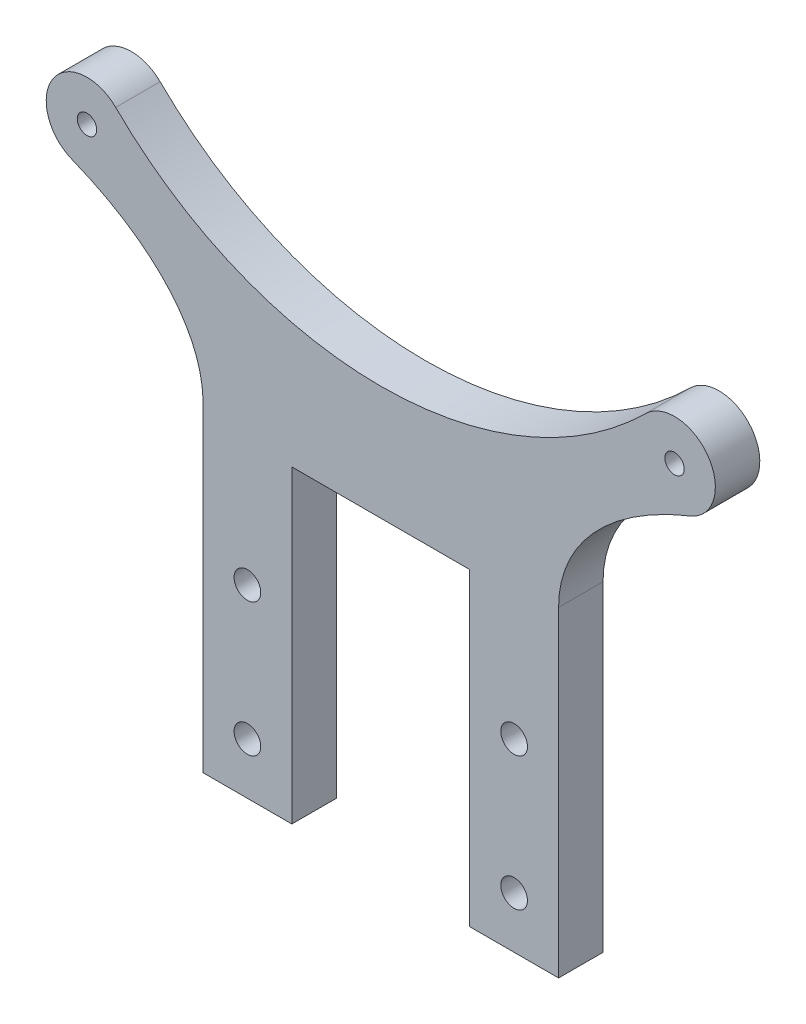
ISO-10303-21;
HEADER;
FILE_DESCRIPTION(('STEP AP214'),'2;1');
FILE_NAME('part.step','',(''),(''),'','','');
FILE_SCHEMA(('AUTOMOTIVE_DESIGN { 1 0 10303 214 1 1 1 1 }'));
ENDSEC;
DATA;
#1=APPLICATION_CONTEXT('core data for automotive mechanical design processes');
#2=APPLICATION_PROTOCOL_DEFINITION('international standard','automotive_design',2000,#1);
#3=PRODUCT_CONTEXT('',#1,'mechanical');
#4=PRODUCT('Part','Part','',(#3));
#5=PRODUCT_RELATED_PRODUCT_CATEGORY('part','',(#4));
#6=PRODUCT_DEFINITION_FORMATION('','',#4);
#7=PRODUCT_DEFINITION_CONTEXT('part definition',#1,'design');
#8=PRODUCT_DEFINITION('design','',#6,#7);
#9=PRODUCT_DEFINITION_SHAPE('','',#8);
#10=(LENGTH_UNIT() NAMED_UNIT(*) SI_UNIT(.MILLI.,.METRE.));
#11=(NAMED_UNIT(*) PLANE_ANGLE_UNIT() SI_UNIT($,.RADIAN.));
#12=(NAMED_UNIT(*) SI_UNIT($,.STERADIAN.) SOLID_ANGLE_UNIT());
#13=UNCERTAINTY_MEASURE_WITH_UNIT(LENGTH_MEASURE(1.E-05),#10,'distance_accuracy_value','');
#14=(GEOMETRIC_REPRESENTATION_CONTEXT(3) GLOBAL_UNCERTAINTY_ASSIGNED_CONTEXT((#13)) GLOBAL_UNIT_ASSIGNED_CONTEXT((#10,
#11,#12)) REPRESENTATION_CONTEXT('',''));
#15=CARTESIAN_POINT('',(0.,0.,0.));
#16=DIRECTION('',(0.,0.,1.));
#17=DIRECTION('',(1.,0.,0.));
#18=AXIS2_PLACEMENT_3D('',#15,#16,#17);
#19=CARTESIAN_POINT('',(-68.6622200178345,1.67032816320576,6.35));
#20=DIRECTION('',(0.,0.,-1.));
#21=DIRECTION('',(-1.,0.,0.));
#22=AXIS2_PLACEMENT_3D('',#19,#20,#21);
#23=PLANE('',#22);
#24=CARTESIAN_POINT('',(19.05,-36.83,6.35));
#25=DIRECTION('',(0.,0.,1.));
#26=DIRECTION('',(-1.,0.,0.));
#27=AXIS2_PLACEMENT_3D('',#24,#25,#26);
#28=CIRCLE('',#27,1.905);
#29=CARTESIAN_POINT('',(17.145,-36.83,6.35));
#30=VERTEX_POINT('',#29);
#31=EDGE_CURVE('E315',#30,#30,#28,.T.);
#32=ORIENTED_EDGE('',*,*,#31,.F.);
#33=EDGE_LOOP('',(#32));
#34=FACE_BOUND('',#33,.T.);
#35=CARTESIAN_POINT('',(-19.05,-17.78,6.35));
#36=DIRECTION('',(0.,0.,1.));
#37=DIRECTION('',(1.,0.,0.));
#38=AXIS2_PLACEMENT_3D('',#35,#36,#37);
#39=CIRCLE('',#38,1.905);
#40=CARTESIAN_POINT('',(-17.145,-17.78,6.35));
#41=VERTEX_POINT('',#40);
#42=EDGE_CURVE('E303',#41,#41,#39,.T.);
#43=ORIENTED_EDGE('',*,*,#42,.F.);
#44=EDGE_LOOP('',(#43));
#45=FACE_BOUND('',#44,.T.);
#46=CARTESIAN_POINT('',(-41.964300524372,27.7449038124335,6.35));
#47=DIRECTION('',(0.,0.,1.));
#48=DIRECTION('',(1.,0.,0.));
#49=AXIS2_PLACEMENT_3D('',#46,#47,#48);
#50=CIRCLE('',#49,1.3890625);
#51=CARTESIAN_POINT('',(-40.575238024372,27.7449038124335,6.35));
#52=VERTEX_POINT('',#51);
#53=EDGE_CURVE('E159',#52,#52,#50,.T.);
#54=ORIENTED_EDGE('',*,*,#53,.F.);
#55=EDGE_LOOP('',(#54));
#56=FACE_BOUND('',#55,.T.);
#57=DIRECTION('',(0.,1.,0.));
#58=VECTOR('',#57,1.);
#59=CARTESIAN_POINT('',(-12.7,0.,6.35));
#60=LINE('',#59,#58);
#61=CARTESIAN_POINT('',(-12.7,-44.1799362896269,6.35));
#62=VERTEX_POINT('',#61);
#63=CARTESIAN_POINT('',(-12.7,0.,6.35));
#64=VERTEX_POINT('',#63);
#65=EDGE_CURVE('E178',#62,#64,#60,.T.);
#66=ORIENTED_EDGE('',*,*,#65,.T.);
#67=DIRECTION('',(1.,0.,0.));
#68=VECTOR('',#67,1.);
#69=CARTESIAN_POINT('',(-12.7,0.,6.35));
#70=LINE('',#69,#68);
#71=CARTESIAN_POINT('',(12.7,0.,6.35));
#72=VERTEX_POINT('',#71);
#73=EDGE_CURVE('E105',#64,#72,#70,.T.);
#74=ORIENTED_EDGE('',*,*,#73,.T.);
#75=DIRECTION('',(0.,-1.,0.));
#76=VECTOR('',#75,1.);
#77=CARTESIAN_POINT('',(12.7,0.,6.35));
#78=LINE('',#77,#76);
#79=CARTESIAN_POINT('',(12.7,-44.1799362896269,6.35));
#80=VERTEX_POINT('',#79);
#81=EDGE_CURVE('E205',#72,#80,#78,.T.);
#82=ORIENTED_EDGE('',*,*,#81,.T.);
#83=DIRECTION('',(1.,0.,0.));
#84=VECTOR('',#83,1.);
#85=CARTESIAN_POINT('',(25.4,-44.1799362896269,6.35));
#86=LINE('',#85,#84);
#87=CARTESIAN_POINT('',(25.4,-44.1799362896269,6.35));
#88=VERTEX_POINT('',#87);
#89=EDGE_CURVE('E224',#80,#88,#86,.T.);
#90=ORIENTED_EDGE('',*,*,#89,.T.);
#91=DIRECTION('',(0.,1.,0.));
#92=VECTOR('',#91,1.);
#93=CARTESIAN_POINT('',(25.4,1.6703281632059,6.35));
#94=LINE('',#93,#92);
#95=CARTESIAN_POINT('',(25.4,1.6703281632059,6.35));
#96=VERTEX_POINT('',#95);
#97=EDGE_CURVE('E221',#88,#96,#94,.T.);
#98=ORIENTED_EDGE('',*,*,#97,.T.);
#99=CARTESIAN_POINT('',(68.6622200178345,1.67032816320576,6.35));
#100=DIRECTION('',(0.,0.,-1.));
#101=DIRECTION('',(-1.,0.,0.));
#102=AXIS2_PLACEMENT_3D('',#99,#100,#101);
#103=ELLIPSE('',#102,43.2622200178345,25.0857126340961);
#104=CARTESIAN_POINT('',(44.1259495460451,22.3312444491636,6.35));
#105=VERTEX_POINT('',#104);
#106=EDGE_CURVE('E223',#96,#105,#103,.T.);
#107=ORIENTED_EDGE('',*,*,#106,.T.);
#108=CARTESIAN_POINT('',(41.964300524372,27.7449038124335,6.35));
#109=DIRECTION('',(0.,0.,1.));
#110=DIRECTION('',(-1.,0.,0.));
#111=AXIS2_PLACEMENT_3D('',#108,#109,#110);
#112=CIRCLE('',#111,5.82927389941654);
#113=CARTESIAN_POINT('',(37.865222263156,31.8895378858885,6.35));
#114=VERTEX_POINT('',#113);
#115=EDGE_CURVE('E226',#105,#114,#112,.T.);
#116=ORIENTED_EDGE('',*,*,#115,.T.);
#117=CARTESIAN_POINT('',(0.,70.1755818181818,6.35));
#118=DIRECTION('',(0.,0.,-1.));
#119=DIRECTION('',(-1.,0.,0.));
#120=AXIS2_PLACEMENT_3D('',#117,#118,#119);
#121=CIRCLE('',#120,53.8478989100196);
#122=CARTESIAN_POINT('',(-37.865222263156,31.8895378858885,6.35));
#123=VERTEX_POINT('',#122);
#124=EDGE_CURVE('E487',#114,#123,#121,.T.);
#125=ORIENTED_EDGE('',*,*,#124,.T.);
#126=CARTESIAN_POINT('',(-41.964300524372,27.7449038124335,6.35));
#127=DIRECTION('',(0.,0.,1.));
#128=DIRECTION('',(1.,0.,0.));
#129=AXIS2_PLACEMENT_3D('',#126,#127,#128);
#130=CIRCLE('',#129,5.82927389941654);
#131=CARTESIAN_POINT('',(-44.1259495460451,22.3312444491636,6.35));
#132=VERTEX_POINT('',#131);
#133=EDGE_CURVE('E136',#123,#132,#130,.T.);
#134=ORIENTED_EDGE('',*,*,#133,.T.);
#135=CARTESIAN_POINT('',(-68.6622200178345,1.67032816320576,6.35));
#136=DIRECTION('',(0.,0.,-1.));
#137=DIRECTION('',(1.,0.,0.));
#138=AXIS2_PLACEMENT_3D('',#135,#136,#137);
#139=ELLIPSE('',#138,43.2622200178345,25.0857126340961);
#140=CARTESIAN_POINT('',(-25.4,1.67032816320593,6.35));
#141=VERTEX_POINT('',#140);
#142=EDGE_CURVE('E130',#132,#141,#139,.T.);
#143=ORIENTED_EDGE('',*,*,#142,.T.);
#144=DIRECTION('',(0.,-1.,0.));
#145=VECTOR('',#144,1.);
#146=CARTESIAN_POINT('',(-25.4,1.67032816320592,6.35));
#147=LINE('',#146,#145);
#148=CARTESIAN_POINT('',(-25.4,-44.1799362896269,6.35));
#149=VERTEX_POINT('',#148);
#150=EDGE_CURVE('E134',#141,#149,#147,.T.);
#151=ORIENTED_EDGE('',*,*,#150,.T.);
#152=DIRECTION('',(1.,0.,0.));
#153=VECTOR('',#152,1.);
#154=CARTESIAN_POINT('',(-25.4,-44.1799362896269,6.35));
#155=LINE('',#154,#153);
#156=EDGE_CURVE('E50',#149,#62,#155,.T.);
#157=ORIENTED_EDGE('',*,*,#156,.T.);
#158=EDGE_LOOP('',(#66,#74,#82,#90,#98,#107,#116,#125,#134,#143,#151,#157));
#159=FACE_BOUND('',#158,.T.);
#160=CARTESIAN_POINT('',(41.964300524372,27.7449038124335,6.35));
#161=DIRECTION('',(0.,0.,1.));
#162=DIRECTION('',(-1.,0.,0.));
#163=AXIS2_PLACEMENT_3D('',#160,#161,#162);
#164=CIRCLE('',#163,1.3890625);
#165=CARTESIAN_POINT('',(40.575238024372,27.7449038124335,6.35));
#166=VERTEX_POINT('',#165);
#167=EDGE_CURVE('E297',#166,#166,#164,.T.);
#168=ORIENTED_EDGE('',*,*,#167,.F.);
#169=EDGE_LOOP('',(#168));
#170=FACE_BOUND('',#169,.T.);
#171=CARTESIAN_POINT('',(-19.05,-36.83,6.35));
#172=DIRECTION('',(0.,0.,1.));
#173=DIRECTION('',(1.,0.,0.));
#174=AXIS2_PLACEMENT_3D('',#171,#172,#173);
#175=CIRCLE('',#174,1.905);
#176=CARTESIAN_POINT('',(-17.145,-36.83,6.35));
#177=VERTEX_POINT('',#176);
#178=EDGE_CURVE('E309',#177,#177,#175,.T.);
#179=ORIENTED_EDGE('',*,*,#178,.F.);
#180=EDGE_LOOP('',(#179));
#181=FACE_BOUND('',#180,.T.);
#182=CARTESIAN_POINT('',(19.05,-17.78,6.35));
#183=DIRECTION('',(0.,0.,1.));
#184=DIRECTION('',(-1.,0.,0.));
#185=AXIS2_PLACEMENT_3D('',#182,#183,#184);
#186=CIRCLE('',#185,1.905);
#187=CARTESIAN_POINT('',(17.145,-17.78,6.35));
#188=VERTEX_POINT('',#187);
#189=EDGE_CURVE('E321',#188,#188,#186,.T.);
#190=ORIENTED_EDGE('',*,*,#189,.F.);
#191=EDGE_LOOP('',(#190));
#192=FACE_BOUND('',#191,.T.);
#193=ADVANCED_FACE('F33',(#34,#45,#56,#159,#170,#181,#192),#23,.F.);
#194=CARTESIAN_POINT('',(-68.6622200178345,1.67032816320576,0.));
#195=DIRECTION('',(0.,0.,-1.));
#196=DIRECTION('',(-1.,0.,0.));
#197=AXIS2_PLACEMENT_3D('',#194,#195,#196);
#198=PLANE('',#197);
#199=CARTESIAN_POINT('',(19.05,-36.83,0.));
#200=DIRECTION('',(0.,0.,1.));
#201=DIRECTION('',(-1.,0.,0.));
#202=AXIS2_PLACEMENT_3D('',#199,#200,#201);
#203=CIRCLE('',#202,1.905);
#204=CARTESIAN_POINT('',(17.145,-36.83,0.));
#205=VERTEX_POINT('',#204);
#206=EDGE_CURVE('E318',#205,#205,#203,.T.);
#207=ORIENTED_EDGE('',*,*,#206,.T.);
#208=EDGE_LOOP('',(#207));
#209=FACE_BOUND('',#208,.T.);
#210=CARTESIAN_POINT('',(-19.05,-17.78,0.));
#211=DIRECTION('',(0.,0.,1.));
#212=DIRECTION('',(1.,0.,0.));
#213=AXIS2_PLACEMENT_3D('',#210,#211,#212);
#214=CIRCLE('',#213,1.905);
#215=CARTESIAN_POINT('',(-17.145,-17.78,0.));
#216=VERTEX_POINT('',#215);
#217=EDGE_CURVE('E306',#216,#216,#214,.T.);
#218=ORIENTED_EDGE('',*,*,#217,.T.);
#219=EDGE_LOOP('',(#218));
#220=FACE_BOUND('',#219,.T.);
#221=CARTESIAN_POINT('',(-41.964300524372,27.7449038124335,0.));
#222=DIRECTION('',(0.,0.,1.));
#223=DIRECTION('',(1.,0.,0.));
#224=AXIS2_PLACEMENT_3D('',#221,#222,#223);
#225=CIRCLE('',#224,1.3890625);
#226=CARTESIAN_POINT('',(-40.575238024372,27.7449038124335,0.));
#227=VERTEX_POINT('',#226);
#228=EDGE_CURVE('E294',#227,#227,#225,.T.);
#229=ORIENTED_EDGE('',*,*,#228,.T.);
#230=EDGE_LOOP('',(#229));
#231=FACE_BOUND('',#230,.T.);
#232=DIRECTION('',(0.,1.,0.));
#233=VECTOR('',#232,1.);
#234=CARTESIAN_POINT('',(-12.7,0.,0.));
#235=LINE('',#234,#233);
#236=CARTESIAN_POINT('',(-12.7,-44.1799362896269,0.));
#237=VERTEX_POINT('',#236);
#238=CARTESIAN_POINT('',(-12.7,0.,0.));
#239=VERTEX_POINT('',#238);
#240=EDGE_CURVE('E155',#237,#239,#235,.T.);
#241=ORIENTED_EDGE('',*,*,#240,.F.);
#242=DIRECTION('',(1.,0.,0.));
#243=VECTOR('',#242,1.);
#244=CARTESIAN_POINT('',(-25.4,-44.1799362896269,0.));
#245=LINE('',#244,#243);
#246=CARTESIAN_POINT('',(-25.4,-44.1799362896269,0.));
#247=VERTEX_POINT('',#246);
#248=EDGE_CURVE('E97',#247,#237,#245,.T.);
#249=ORIENTED_EDGE('',*,*,#248,.F.);
#250=DIRECTION('',(0.,-1.,0.));
#251=VECTOR('',#250,1.);
#252=CARTESIAN_POINT('',(-25.4,1.67032816320592,0.));
#253=LINE('',#252,#251);
#254=CARTESIAN_POINT('',(-25.4,1.67032816320593,0.));
#255=VERTEX_POINT('',#254);
#256=EDGE_CURVE('E91',#255,#247,#253,.T.);
#257=ORIENTED_EDGE('',*,*,#256,.F.);
#258=CARTESIAN_POINT('',(-68.6622200178345,1.67032816320576,0.));
#259=DIRECTION('',(0.,0.,-1.));
#260=DIRECTION('',(1.,0.,0.));
#261=AXIS2_PLACEMENT_3D('',#258,#259,#260);
#262=ELLIPSE('',#261,43.2622200178345,25.0857126340961);
#263=CARTESIAN_POINT('',(-44.1259495460451,22.3312444491636,0.));
#264=VERTEX_POINT('',#263);
#265=EDGE_CURVE('E144',#264,#255,#262,.T.);
#266=ORIENTED_EDGE('',*,*,#265,.F.);
#267=CARTESIAN_POINT('',(-41.964300524372,27.7449038124335,0.));
#268=DIRECTION('',(0.,0.,1.));
#269=DIRECTION('',(1.,0.,0.));
#270=AXIS2_PLACEMENT_3D('',#267,#268,#269);
#271=CIRCLE('',#270,5.82927389941654);
#272=CARTESIAN_POINT('',(-37.865222263156,31.8895378858885,0.));
#273=VERTEX_POINT('',#272);
#274=EDGE_CURVE('E173',#273,#264,#271,.T.);
#275=ORIENTED_EDGE('',*,*,#274,.F.);
#276=CARTESIAN_POINT('',(0.,70.1755818181818,0.));
#277=DIRECTION('',(0.,0.,-1.));
#278=DIRECTION('',(-1.,0.,0.));
#279=AXIS2_PLACEMENT_3D('',#276,#277,#278);
#280=CIRCLE('',#279,53.8478989100196);
#281=CARTESIAN_POINT('',(37.865222263156,31.8895378858885,0.));
#282=VERTEX_POINT('',#281);
#283=EDGE_CURVE('E171',#282,#273,#280,.T.);
#284=ORIENTED_EDGE('',*,*,#283,.F.);
#285=CARTESIAN_POINT('',(41.964300524372,27.7449038124335,0.));
#286=DIRECTION('',(0.,0.,1.));
#287=DIRECTION('',(-1.,0.,0.));
#288=AXIS2_PLACEMENT_3D('',#285,#286,#287);
#289=CIRCLE('',#288,5.82927389941654);
#290=CARTESIAN_POINT('',(44.1259495460451,22.3312444491636,0.));
#291=VERTEX_POINT('',#290);
#292=EDGE_CURVE('E169',#291,#282,#289,.T.);
#293=ORIENTED_EDGE('',*,*,#292,.F.);
#294=CARTESIAN_POINT('',(68.6622200178345,1.67032816320576,0.));
#295=DIRECTION('',(0.,0.,-1.));
#296=DIRECTION('',(-1.,0.,0.));
#297=AXIS2_PLACEMENT_3D('',#294,#295,#296);
#298=ELLIPSE('',#297,43.2622200178345,25.0857126340961);
#299=CARTESIAN_POINT('',(25.4,1.6703281632059,0.));
#300=VERTEX_POINT('',#299);
#301=EDGE_CURVE('E167',#300,#291,#298,.T.);
#302=ORIENTED_EDGE('',*,*,#301,.F.);
#303=DIRECTION('',(0.,1.,0.));
#304=VECTOR('',#303,1.);
#305=CARTESIAN_POINT('',(25.4,1.6703281632059,0.));
#306=LINE('',#305,#304);
#307=CARTESIAN_POINT('',(25.4,-44.1799362896269,0.));
#308=VERTEX_POINT('',#307);
#309=EDGE_CURVE('E165',#308,#300,#306,.T.);
#310=ORIENTED_EDGE('',*,*,#309,.F.);
#311=DIRECTION('',(1.,0.,0.));
#312=VECTOR('',#311,1.);
#313=CARTESIAN_POINT('',(25.4,-44.1799362896269,0.));
#314=LINE('',#313,#312);
#315=CARTESIAN_POINT('',(12.7,-44.1799362896269,0.));
#316=VERTEX_POINT('',#315);
#317=EDGE_CURVE('E163',#316,#308,#314,.T.);
#318=ORIENTED_EDGE('',*,*,#317,.F.);
#319=DIRECTION('',(0.,-1.,0.));
#320=VECTOR('',#319,1.);
#321=CARTESIAN_POINT('',(12.7,0.,0.));
#322=LINE('',#321,#320);
#323=CARTESIAN_POINT('',(12.7,0.,0.));
#324=VERTEX_POINT('',#323);
#325=EDGE_CURVE('E161',#324,#316,#322,.T.);
#326=ORIENTED_EDGE('',*,*,#325,.F.);
#327=DIRECTION('',(1.,0.,0.));
#328=VECTOR('',#327,1.);
#329=CARTESIAN_POINT('',(-12.7,0.,0.));
#330=LINE('',#329,#328);
#331=EDGE_CURVE('E158',#239,#324,#330,.T.);
#332=ORIENTED_EDGE('',*,*,#331,.F.);
#333=EDGE_LOOP('',(#241,#249,#257,#266,#275,#284,#293,#302,#310,#318,#326,#332));
#334=FACE_BOUND('',#333,.T.);
#335=CARTESIAN_POINT('',(41.964300524372,27.7449038124335,0.));
#336=DIRECTION('',(0.,0.,1.));
#337=DIRECTION('',(-1.,0.,0.));
#338=AXIS2_PLACEMENT_3D('',#335,#336,#337);
#339=CIRCLE('',#338,1.3890625);
#340=CARTESIAN_POINT('',(40.575238024372,27.7449038124335,0.));
#341=VERTEX_POINT('',#340);
#342=EDGE_CURVE('E300',#341,#341,#339,.T.);
#343=ORIENTED_EDGE('',*,*,#342,.T.);
#344=EDGE_LOOP('',(#343));
#345=FACE_BOUND('',#344,.T.);
#346=CARTESIAN_POINT('',(-19.05,-36.83,0.));
#347=DIRECTION('',(0.,0.,1.));
#348=DIRECTION('',(1.,0.,0.));
#349=AXIS2_PLACEMENT_3D('',#346,#347,#348);
#350=CIRCLE('',#349,1.905);
#351=CARTESIAN_POINT('',(-17.145,-36.83,0.));
#352=VERTEX_POINT('',#351);
#353=EDGE_CURVE('E312',#352,#352,#350,.T.);
#354=ORIENTED_EDGE('',*,*,#353,.T.);
#355=EDGE_LOOP('',(#354));
#356=FACE_BOUND('',#355,.T.);
#357=CARTESIAN_POINT('',(19.05,-17.78,0.));
#358=DIRECTION('',(0.,0.,1.));
#359=DIRECTION('',(-1.,0.,0.));
#360=AXIS2_PLACEMENT_3D('',#357,#358,#359);
#361=CIRCLE('',#360,1.905);
#362=CARTESIAN_POINT('',(17.145,-17.78,0.));
#363=VERTEX_POINT('',#362);
#364=EDGE_CURVE('E324',#363,#363,#361,.T.);
#365=ORIENTED_EDGE('',*,*,#364,.T.);
#366=EDGE_LOOP('',(#365));
#367=FACE_BOUND('',#366,.T.);
#368=ADVANCED_FACE('F209',(#209,#220,#231,#334,#345,#356,#367),#198,.T.);
#369=CARTESIAN_POINT('',(-12.7,0.,6.35));
#370=DIRECTION('',(-1.,0.,0.));
#371=DIRECTION('',(0.,0.,1.));
#372=AXIS2_PLACEMENT_3D('',#369,#370,#371);
#373=PLANE('',#372);
#374=ORIENTED_EDGE('',*,*,#240,.T.);
#375=DIRECTION('',(0.,0.,-1.));
#376=VECTOR('',#375,1.);
#377=CARTESIAN_POINT('',(-12.7,0.,6.35));
#378=LINE('',#377,#376);
#379=EDGE_CURVE('E11',#64,#239,#378,.T.);
#380=ORIENTED_EDGE('',*,*,#379,.F.);
#381=ORIENTED_EDGE('',*,*,#65,.F.);
#382=DIRECTION('',(0.,0.,-1.));
#383=VECTOR('',#382,1.);
#384=CARTESIAN_POINT('',(-12.7,-44.1799362896269,6.35));
#385=LINE('',#384,#383);
#386=EDGE_CURVE('E150',#62,#237,#385,.T.);
#387=ORIENTED_EDGE('',*,*,#386,.T.);
#388=EDGE_LOOP('',(#374,#380,#381,#387));
#389=FACE_BOUND('',#388,.T.);
#390=ADVANCED_FACE('F35',(#389),#373,.F.);
#391=CARTESIAN_POINT('',(-12.7,0.,6.35));
#392=DIRECTION('',(0.,1.,0.));
#393=DIRECTION('',(-1.,0.,0.));
#394=AXIS2_PLACEMENT_3D('',#391,#392,#393);
#395=PLANE('',#394);
#396=ORIENTED_EDGE('',*,*,#331,.T.);
#397=DIRECTION('',(0.,0.,-1.));
#398=VECTOR('',#397,1.);
#399=CARTESIAN_POINT('',(12.7,0.,6.35));
#400=LINE('',#399,#398);
#401=EDGE_CURVE('E42',#72,#324,#400,.T.);
#402=ORIENTED_EDGE('',*,*,#401,.F.);
#403=ORIENTED_EDGE('',*,*,#73,.F.);
#404=ORIENTED_EDGE('',*,*,#379,.T.);
#405=EDGE_LOOP('',(#396,#402,#403,#404));
#406=FACE_BOUND('',#405,.T.);
#407=ADVANCED_FACE('F246',(#406),#395,.F.);
#408=CARTESIAN_POINT('',(12.7,0.,6.35));
#409=DIRECTION('',(1.,0.,0.));
#410=DIRECTION('',(0.,1.,0.));
#411=AXIS2_PLACEMENT_3D('',#408,#409,#410);
#412=PLANE('',#411);
#413=ORIENTED_EDGE('',*,*,#325,.T.);
#414=DIRECTION('',(0.,0.,-1.));
#415=VECTOR('',#414,1.);
#416=CARTESIAN_POINT('',(12.7,-44.1799362896269,6.35));
#417=LINE('',#416,#415);
#418=EDGE_CURVE('E197',#80,#316,#417,.T.);
#419=ORIENTED_EDGE('',*,*,#418,.F.);
#420=ORIENTED_EDGE('',*,*,#81,.F.);
#421=ORIENTED_EDGE('',*,*,#401,.T.);
#422=EDGE_LOOP('',(#413,#419,#420,#421));
#423=FACE_BOUND('',#422,.T.);
#424=ADVANCED_FACE('F203',(#423),#412,.F.);
#425=CARTESIAN_POINT('',(25.4,-44.1799362896269,6.35));
#426=DIRECTION('',(0.,1.,0.));
#427=DIRECTION('',(-1.,0.,0.));
#428=AXIS2_PLACEMENT_3D('',#425,#426,#427);
#429=PLANE('',#428);
#430=ORIENTED_EDGE('',*,*,#317,.T.);
#431=DIRECTION('',(0.,0.,-1.));
#432=VECTOR('',#431,1.);
#433=CARTESIAN_POINT('',(25.4,-44.1799362896269,6.35));
#434=LINE('',#433,#432);
#435=EDGE_CURVE('E194',#88,#308,#434,.T.);
#436=ORIENTED_EDGE('',*,*,#435,.F.);
#437=ORIENTED_EDGE('',*,*,#89,.F.);
#438=ORIENTED_EDGE('',*,*,#418,.T.);
#439=EDGE_LOOP('',(#430,#436,#437,#438));
#440=FACE_BOUND('',#439,.T.);
#441=ADVANCED_FACE('F215',(#440),#429,.F.);
#442=CARTESIAN_POINT('',(25.4,1.6703281632059,6.35));
#443=DIRECTION('',(-1.,0.,0.));
#444=DIRECTION('',(0.,-1.,0.));
#445=AXIS2_PLACEMENT_3D('',#442,#443,#444);
#446=PLANE('',#445);
#447=ORIENTED_EDGE('',*,*,#309,.T.);
#448=DIRECTION('',(0.,0.,-1.));
#449=VECTOR('',#448,1.);
#450=CARTESIAN_POINT('',(25.4,1.6703281632059,6.35));
#451=LINE('',#450,#449);
#452=EDGE_CURVE('E191',#96,#300,#451,.T.);
#453=ORIENTED_EDGE('',*,*,#452,.F.);
#454=ORIENTED_EDGE('',*,*,#97,.F.);
#455=ORIENTED_EDGE('',*,*,#435,.T.);
#456=EDGE_LOOP('',(#447,#453,#454,#455));
#457=FACE_BOUND('',#456,.T.);
#458=ADVANCED_FACE('F219',(#457),#446,.F.);
#459=DIRECTION('',(0.,0.,-1.));
#460=VECTOR('',#459,1.);
#461=SURFACE_OF_LINEAR_EXTRUSION('',#103,#460);
#462=ORIENTED_EDGE('',*,*,#301,.T.);
#463=DIRECTION('',(0.,0.,-1.));
#464=VECTOR('',#463,1.);
#465=CARTESIAN_POINT('',(44.1259495460451,22.3312444491636,6.35));
#466=LINE('',#465,#464);
#467=EDGE_CURVE('E188',#105,#291,#466,.T.);
#468=ORIENTED_EDGE('',*,*,#467,.F.);
#469=ORIENTED_EDGE('',*,*,#106,.F.);
#470=ORIENTED_EDGE('',*,*,#452,.T.);
#471=EDGE_LOOP('',(#462,#468,#469,#470));
#472=FACE_BOUND('',#471,.T.);
#473=ADVANCED_FACE('F234',(#472),#461,.F.);
#474=CARTESIAN_POINT('',(41.964300524372,27.7449038124335,6.35));
#475=DIRECTION('',(0.,0.,-1.));
#476=DIRECTION('',(-1.,0.,0.));
#477=AXIS2_PLACEMENT_3D('',#474,#475,#476);
#478=CYLINDRICAL_SURFACE('',#477,5.82927389941654);
#479=ORIENTED_EDGE('',*,*,#292,.T.);
#480=DIRECTION('',(0.,0.,-1.));
#481=VECTOR('',#480,1.);
#482=CARTESIAN_POINT('',(37.865222263156,31.8895378858885,6.35));
#483=LINE('',#482,#481);
#484=EDGE_CURVE('E185',#114,#282,#483,.T.);
#485=ORIENTED_EDGE('',*,*,#484,.F.);
#486=ORIENTED_EDGE('',*,*,#115,.F.);
#487=ORIENTED_EDGE('',*,*,#467,.T.);
#488=EDGE_LOOP('',(#479,#485,#486,#487));
#489=FACE_BOUND('',#488,.T.);
#490=ADVANCED_FACE('F238',(#489),#478,.T.);
#491=CARTESIAN_POINT('',(0.,70.1755818181818,6.35));
#492=DIRECTION('',(0.,0.,-1.));
#493=DIRECTION('',(-1.,0.,0.));
#494=AXIS2_PLACEMENT_3D('',#491,#492,#493);
#495=CYLINDRICAL_SURFACE('',#494,53.8478989100196);
#496=ORIENTED_EDGE('',*,*,#283,.T.);
#497=DIRECTION('',(0.,0.,-1.));
#498=VECTOR('',#497,1.);
#499=CARTESIAN_POINT('',(-37.865222263156,31.8895378858885,6.35));
#500=LINE('',#499,#498);
#501=EDGE_CURVE('E182',#123,#273,#500,.T.);
#502=ORIENTED_EDGE('',*,*,#501,.F.);
#503=ORIENTED_EDGE('',*,*,#124,.F.);
#504=ORIENTED_EDGE('',*,*,#484,.T.);
#505=EDGE_LOOP('',(#496,#502,#503,#504));
#506=FACE_BOUND('',#505,.T.);
#507=ADVANCED_FACE('F275',(#506),#495,.F.);
#508=CARTESIAN_POINT('',(-41.964300524372,27.7449038124335,6.35));
#509=DIRECTION('',(0.,0.,-1.));
#510=DIRECTION('',(-1.,0.,0.));
#511=AXIS2_PLACEMENT_3D('',#508,#509,#510);
#512=CYLINDRICAL_SURFACE('',#511,5.82927389941654);
#513=ORIENTED_EDGE('',*,*,#274,.T.);
#514=DIRECTION('',(0.,0.,-1.));
#515=VECTOR('',#514,1.);
#516=CARTESIAN_POINT('',(-44.1259495460451,22.3312444491636,6.35));
#517=LINE('',#516,#515);
#518=EDGE_CURVE('E145',#132,#264,#517,.T.);
#519=ORIENTED_EDGE('',*,*,#518,.F.);
#520=ORIENTED_EDGE('',*,*,#133,.F.);
#521=ORIENTED_EDGE('',*,*,#501,.T.);
#522=EDGE_LOOP('',(#513,#519,#520,#521));
#523=FACE_BOUND('',#522,.T.);
#524=ADVANCED_FACE('F273',(#523),#512,.T.);
#525=DIRECTION('',(0.,0.,-1.));
#526=VECTOR('',#525,1.);
#527=SURFACE_OF_LINEAR_EXTRUSION('',#139,#526);
#528=ORIENTED_EDGE('',*,*,#265,.T.);
#529=DIRECTION('',(0.,0.,-1.));
#530=VECTOR('',#529,1.);
#531=CARTESIAN_POINT('',(-25.4,1.67032816320593,6.35));
#532=LINE('',#531,#530);
#533=EDGE_CURVE('E141',#141,#255,#532,.T.);
#534=ORIENTED_EDGE('',*,*,#533,.F.);
#535=ORIENTED_EDGE('',*,*,#142,.F.);
#536=ORIENTED_EDGE('',*,*,#518,.T.);
#537=EDGE_LOOP('',(#528,#534,#535,#536));
#538=FACE_BOUND('',#537,.T.);
#539=ADVANCED_FACE('F142',(#538),#527,.F.);
#540=CARTESIAN_POINT('',(-25.4,1.67032816320592,6.35));
#541=DIRECTION('',(1.,0.,0.));
#542=DIRECTION('',(0.,0.,-1.));
#543=AXIS2_PLACEMENT_3D('',#540,#541,#542);
#544=PLANE('',#543);
#545=ORIENTED_EDGE('',*,*,#256,.T.);
#546=DIRECTION('',(0.,0.,-1.));
#547=VECTOR('',#546,1.);
#548=CARTESIAN_POINT('',(-25.4,-44.1799362896269,6.35));
#549=LINE('',#548,#547);
#550=EDGE_CURVE('E146',#149,#247,#549,.T.);
#551=ORIENTED_EDGE('',*,*,#550,.F.);
#552=ORIENTED_EDGE('',*,*,#150,.F.);
#553=ORIENTED_EDGE('',*,*,#533,.T.);
#554=EDGE_LOOP('',(#545,#551,#552,#553));
#555=FACE_BOUND('',#554,.T.);
#556=ADVANCED_FACE('F148',(#555),#544,.F.);
#557=CARTESIAN_POINT('',(-25.4,-44.1799362896269,6.35));
#558=DIRECTION('',(0.,1.,0.));
#559=DIRECTION('',(-1.,0.,0.));
#560=AXIS2_PLACEMENT_3D('',#557,#558,#559);
#561=PLANE('',#560);
#562=ORIENTED_EDGE('',*,*,#248,.T.);
#563=ORIENTED_EDGE('',*,*,#386,.F.);
#564=ORIENTED_EDGE('',*,*,#156,.F.);
#565=ORIENTED_EDGE('',*,*,#550,.T.);
#566=EDGE_LOOP('',(#562,#563,#564,#565));
#567=FACE_BOUND('',#566,.T.);
#568=ADVANCED_FACE('F266',(#567),#561,.F.);
#569=CARTESIAN_POINT('',(-41.964300524372,27.7449038124335,6.35));
#570=DIRECTION('',(0.,0.,-1.));
#571=DIRECTION('',(-1.,0.,0.));
#572=AXIS2_PLACEMENT_3D('',#569,#570,#571);
#573=CYLINDRICAL_SURFACE('',#572,1.3890625);
#574=ORIENTED_EDGE('',*,*,#53,.T.);
#575=EDGE_LOOP('',(#574));
#576=FACE_BOUND('',#575,.T.);
#577=ORIENTED_EDGE('',*,*,#228,.F.);
#578=EDGE_LOOP('',(#577));
#579=FACE_BOUND('',#578,.T.);
#580=ADVANCED_FACE('F263',(#576,#579),#573,.F.);
#581=CARTESIAN_POINT('',(41.964300524372,27.7449038124335,6.35));
#582=DIRECTION('',(0.,0.,-1.));
#583=DIRECTION('',(-1.,0.,0.));
#584=AXIS2_PLACEMENT_3D('',#581,#582,#583);
#585=CYLINDRICAL_SURFACE('',#584,1.3890625);
#586=ORIENTED_EDGE('',*,*,#167,.T.);
#587=EDGE_LOOP('',(#586));
#588=FACE_BOUND('',#587,.T.);
#589=ORIENTED_EDGE('',*,*,#342,.F.);
#590=EDGE_LOOP('',(#589));
#591=FACE_BOUND('',#590,.T.);
#592=ADVANCED_FACE('F350',(#588,#591),#585,.F.);
#593=CARTESIAN_POINT('',(-19.05,-17.78,6.35));
#594=DIRECTION('',(0.,0.,-1.));
#595=DIRECTION('',(-1.,0.,0.));
#596=AXIS2_PLACEMENT_3D('',#593,#594,#595);
#597=CYLINDRICAL_SURFACE('',#596,1.905);
#598=ORIENTED_EDGE('',*,*,#42,.T.);
#599=EDGE_LOOP('',(#598));
#600=FACE_BOUND('',#599,.T.);
#601=ORIENTED_EDGE('',*,*,#217,.F.);
#602=EDGE_LOOP('',(#601));
#603=FACE_BOUND('',#602,.T.);
#604=ADVANCED_FACE('F347',(#600,#603),#597,.F.);
#605=CARTESIAN_POINT('',(-19.05,-36.83,6.35));
#606=DIRECTION('',(0.,0.,-1.));
#607=DIRECTION('',(-1.,0.,0.));
#608=AXIS2_PLACEMENT_3D('',#605,#606,#607);
#609=CYLINDRICAL_SURFACE('',#608,1.905);
#610=ORIENTED_EDGE('',*,*,#178,.T.);
#611=EDGE_LOOP('',(#610));
#612=FACE_BOUND('',#611,.T.);
#613=ORIENTED_EDGE('',*,*,#353,.F.);
#614=EDGE_LOOP('',(#613));
#615=FACE_BOUND('',#614,.T.);
#616=ADVANCED_FACE('F341',(#612,#615),#609,.F.);
#617=CARTESIAN_POINT('',(19.05,-36.83,6.35));
#618=DIRECTION('',(0.,0.,-1.));
#619=DIRECTION('',(-1.,0.,0.));
#620=AXIS2_PLACEMENT_3D('',#617,#618,#619);
#621=CYLINDRICAL_SURFACE('',#620,1.905);
#622=ORIENTED_EDGE('',*,*,#31,.T.);
#623=EDGE_LOOP('',(#622));
#624=FACE_BOUND('',#623,.T.);
#625=ORIENTED_EDGE('',*,*,#206,.F.);
#626=EDGE_LOOP('',(#625));
#627=FACE_BOUND('',#626,.T.);
#628=ADVANCED_FACE('F334',(#624,#627),#621,.F.);
#629=CARTESIAN_POINT('',(19.05,-17.78,6.35));
#630=DIRECTION('',(0.,0.,-1.));
#631=DIRECTION('',(-1.,0.,0.));
#632=AXIS2_PLACEMENT_3D('',#629,#630,#631);
#633=CYLINDRICAL_SURFACE('',#632,1.905);
#634=ORIENTED_EDGE('',*,*,#189,.T.);
#635=EDGE_LOOP('',(#634));
#636=FACE_BOUND('',#635,.T.);
#637=ORIENTED_EDGE('',*,*,#364,.F.);
#638=EDGE_LOOP('',(#637));
#639=FACE_BOUND('',#638,.T.);
#640=ADVANCED_FACE('F330',(#636,#639),#633,.F.);
#641=CLOSED_SHELL('',(#193,#368,#390,#407,#424,#441,#458,#473,#490,#507,#524,#539,#556,#568,
#580,#592,#604,#616,#628,#640));
#642=MANIFOLD_SOLID_BREP('B2',#641);
#643=ADVANCED_BREP_SHAPE_REPRESENTATION('',(#18,#642),#14);
#644=SHAPE_DEFINITION_REPRESENTATION(#9,#643);
ENDSEC;
END-ISO-10303-21;
